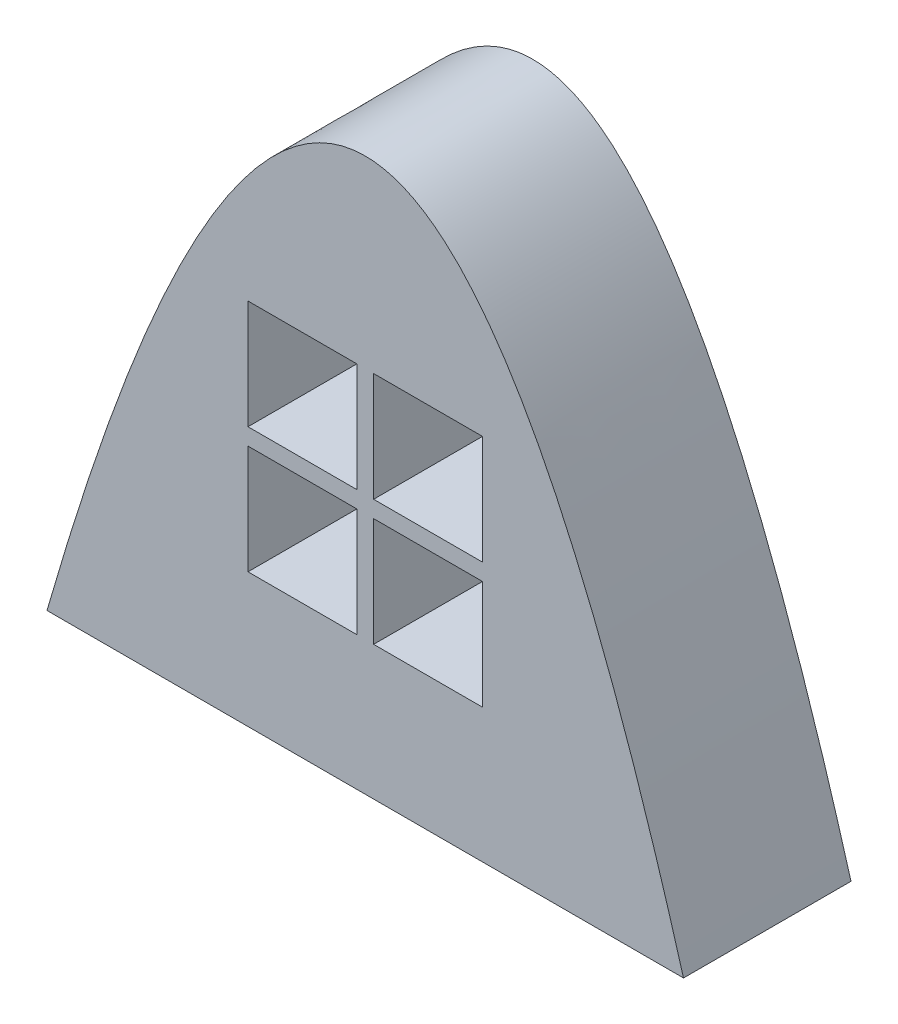
ISO-10303-21;
HEADER;
FILE_DESCRIPTION(('STEP AP214'),'2;1');
FILE_NAME('part.step','',(''),(''),'','','');
FILE_SCHEMA(('AUTOMOTIVE_DESIGN { 1 0 10303 214 1 1 1 1 }'));
ENDSEC;
DATA;
#1=APPLICATION_CONTEXT('core data for automotive mechanical design processes');
#2=APPLICATION_PROTOCOL_DEFINITION('international standard','automotive_design',2000,#1);
#3=PRODUCT_CONTEXT('',#1,'mechanical');
#4=PRODUCT('Part','Part','',(#3));
#5=PRODUCT_RELATED_PRODUCT_CATEGORY('part','',(#4));
#6=PRODUCT_DEFINITION_FORMATION('','',#4);
#7=PRODUCT_DEFINITION_CONTEXT('part definition',#1,'design');
#8=PRODUCT_DEFINITION('design','',#6,#7);
#9=PRODUCT_DEFINITION_SHAPE('','',#8);
#10=(LENGTH_UNIT() NAMED_UNIT(*) SI_UNIT(.MILLI.,.METRE.));
#11=(NAMED_UNIT(*) PLANE_ANGLE_UNIT() SI_UNIT($,.RADIAN.));
#12=(NAMED_UNIT(*) SI_UNIT($,.STERADIAN.) SOLID_ANGLE_UNIT());
#13=UNCERTAINTY_MEASURE_WITH_UNIT(LENGTH_MEASURE(1.E-05),#10,'distance_accuracy_value','');
#14=(GEOMETRIC_REPRESENTATION_CONTEXT(3) GLOBAL_UNCERTAINTY_ASSIGNED_CONTEXT((#13)) GLOBAL_UNIT_ASSIGNED_CONTEXT((#10,
#11,#12)) REPRESENTATION_CONTEXT('',''));
#15=CARTESIAN_POINT('',(0.,0.,0.));
#16=DIRECTION('',(0.,0.,1.));
#17=DIRECTION('',(1.,0.,0.));
#18=AXIS2_PLACEMENT_3D('',#15,#16,#17);
#19=CARTESIAN_POINT('',(0.,0.,10.));
#20=DIRECTION('',(0.,0.,1.));
#21=DIRECTION('',(1.,0.,0.));
#22=AXIS2_PLACEMENT_3D('',#19,#20,#21);
#23=PLANE('',#22);
#24=DIRECTION('',(0.,-1.,0.));
#25=VECTOR('',#24,1.);
#26=CARTESIAN_POINT('',(7.,0.,10.));
#27=LINE('',#26,#25);
#28=CARTESIAN_POINT('',(7.,22.,10.));
#29=VERTEX_POINT('',#28);
#30=CARTESIAN_POINT('',(7.,15.5,10.));
#31=VERTEX_POINT('',#30);
#32=EDGE_CURVE('E269',#29,#31,#27,.T.);
#33=ORIENTED_EDGE('',*,*,#32,.T.);
#34=DIRECTION('',(-1.,0.,0.));
#35=VECTOR('',#34,1.);
#36=CARTESIAN_POINT('',(0.,15.5,10.));
#37=LINE('',#36,#35);
#38=CARTESIAN_POINT('',(0.499999999999999,15.5,10.));
#39=VERTEX_POINT('',#38);
#40=EDGE_CURVE('E272',#31,#39,#37,.T.);
#41=ORIENTED_EDGE('',*,*,#40,.T.);
#42=DIRECTION('',(0.,1.,0.));
#43=VECTOR('',#42,1.);
#44=CARTESIAN_POINT('',(0.499999999999999,0.,10.));
#45=LINE('',#44,#43);
#46=CARTESIAN_POINT('',(0.499999999999999,22.,10.));
#47=VERTEX_POINT('',#46);
#48=EDGE_CURVE('E276',#39,#47,#45,.T.);
#49=ORIENTED_EDGE('',*,*,#48,.T.);
#50=DIRECTION('',(-1.,0.,0.));
#51=VECTOR('',#50,1.);
#52=CARTESIAN_POINT('',(0.,22.,10.));
#53=LINE('',#52,#51);
#54=EDGE_CURVE('E279',#29,#47,#53,.T.);
#55=ORIENTED_EDGE('',*,*,#54,.F.);
#56=EDGE_LOOP('',(#33,#41,#49,#55));
#57=FACE_BOUND('',#56,.T.);
#58=CARTESIAN_POINT('',(-19.,0.,10.));
#59=CARTESIAN_POINT('',(0.,66.,10.));
#60=CARTESIAN_POINT('',(19.,0.,10.));
#61=B_SPLINE_CURVE_WITH_KNOTS('',2,(#58,#59,#60),.UNSPECIFIED.,.F.,.F.,(3,3),(0.,1.),.UNSPECIFIED.);
#62=CARTESIAN_POINT('',(-19.,0.,10.));
#63=VERTEX_POINT('',#62);
#64=CARTESIAN_POINT('',(19.,0.,10.));
#65=VERTEX_POINT('',#64);
#66=EDGE_CURVE('E299',#63,#65,#61,.T.);
#67=ORIENTED_EDGE('',*,*,#66,.F.);
#68=DIRECTION('',(1.,0.,0.));
#69=VECTOR('',#68,1.);
#70=CARTESIAN_POINT('',(0.,0.,10.));
#71=LINE('',#70,#69);
#72=EDGE_CURVE('E305',#63,#65,#71,.T.);
#73=ORIENTED_EDGE('',*,*,#72,.T.);
#74=EDGE_LOOP('',(#67,#73));
#75=FACE_BOUND('',#74,.T.);
#76=DIRECTION('',(0.,1.,0.));
#77=VECTOR('',#76,1.);
#78=CARTESIAN_POINT('',(0.499999999999999,0.,10.));
#79=LINE('',#78,#77);
#80=CARTESIAN_POINT('',(0.499999999999999,8.,10.));
#81=VERTEX_POINT('',#80);
#82=CARTESIAN_POINT('',(0.499999999999999,14.5,10.));
#83=VERTEX_POINT('',#82);
#84=EDGE_CURVE('E179',#81,#83,#79,.T.);
#85=ORIENTED_EDGE('',*,*,#84,.T.);
#86=DIRECTION('',(-1.,0.,0.));
#87=VECTOR('',#86,1.);
#88=CARTESIAN_POINT('',(0.,14.5,10.));
#89=LINE('',#88,#87);
#90=CARTESIAN_POINT('',(7.,14.5,10.));
#91=VERTEX_POINT('',#90);
#92=EDGE_CURVE('E171',#91,#83,#89,.T.);
#93=ORIENTED_EDGE('',*,*,#92,.F.);
#94=DIRECTION('',(0.,-1.,0.));
#95=VECTOR('',#94,1.);
#96=CARTESIAN_POINT('',(7.,0.,10.));
#97=LINE('',#96,#95);
#98=CARTESIAN_POINT('',(7.,8.,10.));
#99=VERTEX_POINT('',#98);
#100=EDGE_CURVE('E183',#91,#99,#97,.T.);
#101=ORIENTED_EDGE('',*,*,#100,.T.);
#102=DIRECTION('',(-1.,0.,0.));
#103=VECTOR('',#102,1.);
#104=CARTESIAN_POINT('',(0.,8.,10.));
#105=LINE('',#104,#103);
#106=EDGE_CURVE('E187',#99,#81,#105,.T.);
#107=ORIENTED_EDGE('',*,*,#106,.T.);
#108=EDGE_LOOP('',(#85,#93,#101,#107));
#109=FACE_BOUND('',#108,.T.);
#110=DIRECTION('',(0.,-1.,0.));
#111=VECTOR('',#110,1.);
#112=CARTESIAN_POINT('',(-7.,0.,10.));
#113=LINE('',#112,#111);
#114=CARTESIAN_POINT('',(-7.,14.5,10.));
#115=VERTEX_POINT('',#114);
#116=CARTESIAN_POINT('',(-7.,8.,10.));
#117=VERTEX_POINT('',#116);
#118=EDGE_CURVE('E218',#115,#117,#113,.T.);
#119=ORIENTED_EDGE('',*,*,#118,.F.);
#120=DIRECTION('',(-1.,0.,0.));
#121=VECTOR('',#120,1.);
#122=CARTESIAN_POINT('',(0.,14.5,10.));
#123=LINE('',#122,#121);
#124=CARTESIAN_POINT('',(-0.500000000000001,14.5,10.));
#125=VERTEX_POINT('',#124);
#126=EDGE_CURVE('E212',#125,#115,#123,.T.);
#127=ORIENTED_EDGE('',*,*,#126,.F.);
#128=DIRECTION('',(0.,1.,0.));
#129=VECTOR('',#128,1.);
#130=CARTESIAN_POINT('',(-0.500000000000001,0.,10.));
#131=LINE('',#130,#129);
#132=CARTESIAN_POINT('',(-0.500000000000001,8.,10.));
#133=VERTEX_POINT('',#132);
#134=EDGE_CURVE('E214',#133,#125,#131,.T.);
#135=ORIENTED_EDGE('',*,*,#134,.F.);
#136=DIRECTION('',(-1.,0.,0.));
#137=VECTOR('',#136,1.);
#138=CARTESIAN_POINT('',(0.,8.,10.));
#139=LINE('',#138,#137);
#140=EDGE_CURVE('E65',#133,#117,#139,.T.);
#141=ORIENTED_EDGE('',*,*,#140,.T.);
#142=EDGE_LOOP('',(#119,#127,#135,#141));
#143=FACE_BOUND('',#142,.T.);
#144=DIRECTION('',(-1.,0.,0.));
#145=VECTOR('',#144,1.);
#146=CARTESIAN_POINT('',(0.,22.,10.));
#147=LINE('',#146,#145);
#148=CARTESIAN_POINT('',(-0.500000000000001,22.,10.));
#149=VERTEX_POINT('',#148);
#150=CARTESIAN_POINT('',(-7.,22.,10.));
#151=VERTEX_POINT('',#150);
#152=EDGE_CURVE('E249',#149,#151,#147,.T.);
#153=ORIENTED_EDGE('',*,*,#152,.F.);
#154=DIRECTION('',(0.,1.,0.));
#155=VECTOR('',#154,1.);
#156=CARTESIAN_POINT('',(-0.500000000000001,0.,10.));
#157=LINE('',#156,#155);
#158=CARTESIAN_POINT('',(-0.500000000000001,15.5,10.));
#159=VERTEX_POINT('',#158);
#160=EDGE_CURVE('E241',#159,#149,#157,.T.);
#161=ORIENTED_EDGE('',*,*,#160,.F.);
#162=DIRECTION('',(-1.,0.,0.));
#163=VECTOR('',#162,1.);
#164=CARTESIAN_POINT('',(0.,15.5,10.));
#165=LINE('',#164,#163);
#166=CARTESIAN_POINT('',(-7.,15.5,10.));
#167=VERTEX_POINT('',#166);
#168=EDGE_CURVE('E243',#159,#167,#165,.T.);
#169=ORIENTED_EDGE('',*,*,#168,.T.);
#170=DIRECTION('',(0.,-1.,0.));
#171=VECTOR('',#170,1.);
#172=CARTESIAN_POINT('',(-7.,0.,10.));
#173=LINE('',#172,#171);
#174=EDGE_CURVE('E247',#151,#167,#173,.T.);
#175=ORIENTED_EDGE('',*,*,#174,.F.);
#176=EDGE_LOOP('',(#153,#161,#169,#175));
#177=FACE_BOUND('',#176,.T.);
#178=ADVANCED_FACE('F41',(#57,#75,#109,#143,#177),#23,.T.);
#179=CARTESIAN_POINT('',(0.,0.,0.));
#180=DIRECTION('',(0.,0.,1.));
#181=DIRECTION('',(1.,0.,0.));
#182=AXIS2_PLACEMENT_3D('',#179,#180,#181);
#183=PLANE('',#182);
#184=DIRECTION('',(-1.,0.,0.));
#185=VECTOR('',#184,1.);
#186=CARTESIAN_POINT('',(0.,14.5,0.));
#187=LINE('',#186,#185);
#188=CARTESIAN_POINT('',(-0.500000000000001,14.5,0.));
#189=VERTEX_POINT('',#188);
#190=CARTESIAN_POINT('',(-7.,14.5,0.));
#191=VERTEX_POINT('',#190);
#192=EDGE_CURVE('E221',#189,#191,#187,.T.);
#193=ORIENTED_EDGE('',*,*,#192,.T.);
#194=DIRECTION('',(0.,-1.,0.));
#195=VECTOR('',#194,1.);
#196=CARTESIAN_POINT('',(-7.,0.,0.));
#197=LINE('',#196,#195);
#198=CARTESIAN_POINT('',(-7.,8.,0.));
#199=VERTEX_POINT('',#198);
#200=EDGE_CURVE('E215',#191,#199,#197,.T.);
#201=ORIENTED_EDGE('',*,*,#200,.T.);
#202=DIRECTION('',(-1.,0.,0.));
#203=VECTOR('',#202,1.);
#204=CARTESIAN_POINT('',(0.,8.,0.));
#205=LINE('',#204,#203);
#206=CARTESIAN_POINT('',(-0.500000000000001,8.,0.));
#207=VERTEX_POINT('',#206);
#208=EDGE_CURVE('E228',#207,#199,#205,.T.);
#209=ORIENTED_EDGE('',*,*,#208,.F.);
#210=DIRECTION('',(0.,1.,0.));
#211=VECTOR('',#210,1.);
#212=CARTESIAN_POINT('',(-0.500000000000001,0.,0.));
#213=LINE('',#212,#211);
#214=EDGE_CURVE('E224',#207,#189,#213,.T.);
#215=ORIENTED_EDGE('',*,*,#214,.T.);
#216=EDGE_LOOP('',(#193,#201,#209,#215));
#217=FACE_BOUND('',#216,.T.);
#218=CARTESIAN_POINT('',(-19.,0.,0.));
#219=CARTESIAN_POINT('',(0.,66.,0.));
#220=CARTESIAN_POINT('',(19.,0.,0.));
#221=B_SPLINE_CURVE_WITH_KNOTS('',2,(#218,#219,#220),.UNSPECIFIED.,.F.,.F.,(3,3),(0.,1.),.UNSPECIFIED.);
#222=CARTESIAN_POINT('',(-19.,0.,0.));
#223=VERTEX_POINT('',#222);
#224=CARTESIAN_POINT('',(19.,0.,0.));
#225=VERTEX_POINT('',#224);
#226=EDGE_CURVE('E293',#223,#225,#221,.T.);
#227=ORIENTED_EDGE('',*,*,#226,.T.);
#228=DIRECTION('',(1.,0.,0.));
#229=VECTOR('',#228,1.);
#230=CARTESIAN_POINT('',(0.,0.,0.));
#231=LINE('',#230,#229);
#232=EDGE_CURVE('E306',#223,#225,#231,.T.);
#233=ORIENTED_EDGE('',*,*,#232,.F.);
#234=EDGE_LOOP('',(#227,#233));
#235=FACE_BOUND('',#234,.T.);
#236=DIRECTION('',(-1.,0.,0.));
#237=VECTOR('',#236,1.);
#238=CARTESIAN_POINT('',(0.,15.5,0.));
#239=LINE('',#238,#237);
#240=CARTESIAN_POINT('',(7.,15.5,0.));
#241=VERTEX_POINT('',#240);
#242=CARTESIAN_POINT('',(0.499999999999999,15.5,0.));
#243=VERTEX_POINT('',#242);
#244=EDGE_CURVE('E283',#241,#243,#239,.T.);
#245=ORIENTED_EDGE('',*,*,#244,.F.);
#246=DIRECTION('',(0.,-1.,0.));
#247=VECTOR('',#246,1.);
#248=CARTESIAN_POINT('',(7.,0.,0.));
#249=LINE('',#248,#247);
#250=CARTESIAN_POINT('',(7.,22.,0.));
#251=VERTEX_POINT('',#250);
#252=EDGE_CURVE('E208',#251,#241,#249,.T.);
#253=ORIENTED_EDGE('',*,*,#252,.F.);
#254=DIRECTION('',(-1.,0.,0.));
#255=VECTOR('',#254,1.);
#256=CARTESIAN_POINT('',(0.,22.,0.));
#257=LINE('',#256,#255);
#258=CARTESIAN_POINT('',(0.499999999999999,22.,0.));
#259=VERTEX_POINT('',#258);
#260=EDGE_CURVE('E273',#251,#259,#257,.T.);
#261=ORIENTED_EDGE('',*,*,#260,.T.);
#262=DIRECTION('',(0.,1.,0.));
#263=VECTOR('',#262,1.);
#264=CARTESIAN_POINT('',(0.499999999999999,0.,0.));
#265=LINE('',#264,#263);
#266=EDGE_CURVE('E286',#243,#259,#265,.T.);
#267=ORIENTED_EDGE('',*,*,#266,.F.);
#268=EDGE_LOOP('',(#245,#253,#261,#267));
#269=FACE_BOUND('',#268,.T.);
#270=DIRECTION('',(-1.,0.,0.));
#271=VECTOR('',#270,1.);
#272=CARTESIAN_POINT('',(0.,14.5,0.));
#273=LINE('',#272,#271);
#274=CARTESIAN_POINT('',(7.,14.5,0.));
#275=VERTEX_POINT('',#274);
#276=CARTESIAN_POINT('',(0.499999999999999,14.5,0.));
#277=VERTEX_POINT('',#276);
#278=EDGE_CURVE('E174',#275,#277,#273,.T.);
#279=ORIENTED_EDGE('',*,*,#278,.T.);
#280=DIRECTION('',(0.,1.,0.));
#281=VECTOR('',#280,1.);
#282=CARTESIAN_POINT('',(0.499999999999999,0.,0.));
#283=LINE('',#282,#281);
#284=CARTESIAN_POINT('',(0.499999999999999,8.,0.));
#285=VERTEX_POINT('',#284);
#286=EDGE_CURVE('E192',#285,#277,#283,.T.);
#287=ORIENTED_EDGE('',*,*,#286,.F.);
#288=DIRECTION('',(-1.,0.,0.));
#289=VECTOR('',#288,1.);
#290=CARTESIAN_POINT('',(0.,8.,0.));
#291=LINE('',#290,#289);
#292=CARTESIAN_POINT('',(7.,8.,0.));
#293=VERTEX_POINT('',#292);
#294=EDGE_CURVE('E195',#293,#285,#291,.T.);
#295=ORIENTED_EDGE('',*,*,#294,.F.);
#296=DIRECTION('',(0.,-1.,0.));
#297=VECTOR('',#296,1.);
#298=CARTESIAN_POINT('',(7.,0.,0.));
#299=LINE('',#298,#297);
#300=EDGE_CURVE('E201',#275,#293,#299,.T.);
#301=ORIENTED_EDGE('',*,*,#300,.F.);
#302=EDGE_LOOP('',(#279,#287,#295,#301));
#303=FACE_BOUND('',#302,.T.);
#304=DIRECTION('',(0.,1.,0.));
#305=VECTOR('',#304,1.);
#306=CARTESIAN_POINT('',(-0.500000000000001,0.,0.));
#307=LINE('',#306,#305);
#308=CARTESIAN_POINT('',(-0.500000000000001,15.5,0.));
#309=VERTEX_POINT('',#308);
#310=CARTESIAN_POINT('',(-0.500000000000001,22.,0.));
#311=VERTEX_POINT('',#310);
#312=EDGE_CURVE('E252',#309,#311,#307,.T.);
#313=ORIENTED_EDGE('',*,*,#312,.T.);
#314=DIRECTION('',(-1.,0.,0.));
#315=VECTOR('',#314,1.);
#316=CARTESIAN_POINT('',(0.,22.,0.));
#317=LINE('',#316,#315);
#318=CARTESIAN_POINT('',(-7.,22.,0.));
#319=VERTEX_POINT('',#318);
#320=EDGE_CURVE('E244',#311,#319,#317,.T.);
#321=ORIENTED_EDGE('',*,*,#320,.T.);
#322=DIRECTION('',(0.,-1.,0.));
#323=VECTOR('',#322,1.);
#324=CARTESIAN_POINT('',(-7.,0.,0.));
#325=LINE('',#324,#323);
#326=CARTESIAN_POINT('',(-7.,15.5,0.));
#327=VERTEX_POINT('',#326);
#328=EDGE_CURVE('E257',#319,#327,#325,.T.);
#329=ORIENTED_EDGE('',*,*,#328,.T.);
#330=DIRECTION('',(-1.,0.,0.));
#331=VECTOR('',#330,1.);
#332=CARTESIAN_POINT('',(0.,15.5,0.));
#333=LINE('',#332,#331);
#334=EDGE_CURVE('E255',#309,#327,#333,.T.);
#335=ORIENTED_EDGE('',*,*,#334,.F.);
#336=EDGE_LOOP('',(#313,#321,#329,#335));
#337=FACE_BOUND('',#336,.T.);
#338=ADVANCED_FACE('F328',(#217,#235,#269,#303,#337),#183,.F.);
#339=DIRECTION('',(0.,0.,-1.));
#340=VECTOR('',#339,1.);
#341=SURFACE_OF_LINEAR_EXTRUSION('',#61,#340);
#342=ORIENTED_EDGE('',*,*,#226,.F.);
#343=DIRECTION('',(0.,0.,-1.));
#344=VECTOR('',#343,1.);
#345=CARTESIAN_POINT('',(-19.,0.,10.));
#346=LINE('',#345,#344);
#347=EDGE_CURVE('E11',#63,#223,#346,.T.);
#348=ORIENTED_EDGE('',*,*,#347,.F.);
#349=ORIENTED_EDGE('',*,*,#66,.T.);
#350=DIRECTION('',(0.,0.,-1.));
#351=VECTOR('',#350,1.);
#352=CARTESIAN_POINT('',(19.,0.,10.));
#353=LINE('',#352,#351);
#354=EDGE_CURVE('E50',#65,#225,#353,.T.);
#355=ORIENTED_EDGE('',*,*,#354,.T.);
#356=EDGE_LOOP('',(#342,#348,#349,#355));
#357=FACE_BOUND('',#356,.T.);
#358=ADVANCED_FACE('F43',(#357),#341,.T.);
#359=CARTESIAN_POINT('',(0.,0.,10.));
#360=DIRECTION('',(0.,1.,0.));
#361=DIRECTION('',(0.,0.,1.));
#362=AXIS2_PLACEMENT_3D('',#359,#360,#361);
#363=PLANE('',#362);
#364=ORIENTED_EDGE('',*,*,#232,.T.);
#365=ORIENTED_EDGE('',*,*,#354,.F.);
#366=ORIENTED_EDGE('',*,*,#72,.F.);
#367=ORIENTED_EDGE('',*,*,#347,.T.);
#368=EDGE_LOOP('',(#364,#365,#366,#367));
#369=FACE_BOUND('',#368,.T.);
#370=ADVANCED_FACE('F326',(#369),#363,.F.);
#371=CARTESIAN_POINT('',(7.,0.,10.));
#372=DIRECTION('',(1.,0.,0.));
#373=DIRECTION('',(0.,0.,-1.));
#374=AXIS2_PLACEMENT_3D('',#371,#372,#373);
#375=PLANE('',#374);
#376=ORIENTED_EDGE('',*,*,#252,.T.);
#377=DIRECTION('',(0.,0.,-1.));
#378=VECTOR('',#377,1.);
#379=CARTESIAN_POINT('',(7.,15.5,10.));
#380=LINE('',#379,#378);
#381=EDGE_CURVE('E281',#31,#241,#380,.T.);
#382=ORIENTED_EDGE('',*,*,#381,.F.);
#383=ORIENTED_EDGE('',*,*,#32,.F.);
#384=DIRECTION('',(0.,0.,-1.));
#385=VECTOR('',#384,1.);
#386=CARTESIAN_POINT('',(7.,22.,10.));
#387=LINE('',#386,#385);
#388=EDGE_CURVE('E291',#29,#251,#387,.T.);
#389=ORIENTED_EDGE('',*,*,#388,.T.);
#390=EDGE_LOOP('',(#376,#382,#383,#389));
#391=FACE_BOUND('',#390,.T.);
#392=ADVANCED_FACE('F370',(#391),#375,.F.);
#393=CARTESIAN_POINT('',(0.,22.,10.));
#394=DIRECTION('',(0.,-1.,0.));
#395=DIRECTION('',(0.,0.,-1.));
#396=AXIS2_PLACEMENT_3D('',#393,#394,#395);
#397=PLANE('',#396);
#398=ORIENTED_EDGE('',*,*,#260,.F.);
#399=ORIENTED_EDGE('',*,*,#388,.F.);
#400=ORIENTED_EDGE('',*,*,#54,.T.);
#401=DIRECTION('',(0.,0.,-1.));
#402=VECTOR('',#401,1.);
#403=CARTESIAN_POINT('',(0.499999999999999,22.,10.));
#404=LINE('',#403,#402);
#405=EDGE_CURVE('E294',#47,#259,#404,.T.);
#406=ORIENTED_EDGE('',*,*,#405,.T.);
#407=EDGE_LOOP('',(#398,#399,#400,#406));
#408=FACE_BOUND('',#407,.T.);
#409=ADVANCED_FACE('F376',(#408),#397,.T.);
#410=CARTESIAN_POINT('',(0.499999999999999,0.,10.));
#411=DIRECTION('',(-1.,0.,0.));
#412=DIRECTION('',(0.,0.,1.));
#413=AXIS2_PLACEMENT_3D('',#410,#411,#412);
#414=PLANE('',#413);
#415=ORIENTED_EDGE('',*,*,#266,.T.);
#416=ORIENTED_EDGE('',*,*,#405,.F.);
#417=ORIENTED_EDGE('',*,*,#48,.F.);
#418=DIRECTION('',(0.,0.,-1.));
#419=VECTOR('',#418,1.);
#420=CARTESIAN_POINT('',(0.499999999999999,15.5,10.));
#421=LINE('',#420,#419);
#422=EDGE_CURVE('E296',#39,#243,#421,.T.);
#423=ORIENTED_EDGE('',*,*,#422,.T.);
#424=EDGE_LOOP('',(#415,#416,#417,#423));
#425=FACE_BOUND('',#424,.T.);
#426=ADVANCED_FACE('F415',(#425),#414,.F.);
#427=CARTESIAN_POINT('',(0.,15.5,10.));
#428=DIRECTION('',(0.,-1.,0.));
#429=DIRECTION('',(0.,0.,-1.));
#430=AXIS2_PLACEMENT_3D('',#427,#428,#429);
#431=PLANE('',#430);
#432=ORIENTED_EDGE('',*,*,#244,.T.);
#433=ORIENTED_EDGE('',*,*,#422,.F.);
#434=ORIENTED_EDGE('',*,*,#40,.F.);
#435=ORIENTED_EDGE('',*,*,#381,.T.);
#436=EDGE_LOOP('',(#432,#433,#434,#435));
#437=FACE_BOUND('',#436,.T.);
#438=ADVANCED_FACE('F425',(#437),#431,.F.);
#439=CARTESIAN_POINT('',(0.,14.5,10.));
#440=DIRECTION('',(0.,-1.,0.));
#441=DIRECTION('',(0.,0.,-1.));
#442=AXIS2_PLACEMENT_3D('',#439,#440,#441);
#443=PLANE('',#442);
#444=ORIENTED_EDGE('',*,*,#278,.F.);
#445=DIRECTION('',(0.,0.,-1.));
#446=VECTOR('',#445,1.);
#447=CARTESIAN_POINT('',(7.,14.5,10.));
#448=LINE('',#447,#446);
#449=EDGE_CURVE('E167',#91,#275,#448,.T.);
#450=ORIENTED_EDGE('',*,*,#449,.F.);
#451=ORIENTED_EDGE('',*,*,#92,.T.);
#452=DIRECTION('',(0.,0.,-1.));
#453=VECTOR('',#452,1.);
#454=CARTESIAN_POINT('',(0.499999999999999,14.5,10.));
#455=LINE('',#454,#453);
#456=EDGE_CURVE('E206',#83,#277,#455,.T.);
#457=ORIENTED_EDGE('',*,*,#456,.T.);
#458=EDGE_LOOP('',(#444,#450,#451,#457));
#459=FACE_BOUND('',#458,.T.);
#460=ADVANCED_FACE('F169',(#459),#443,.T.);
#461=CARTESIAN_POINT('',(0.499999999999999,0.,10.));
#462=DIRECTION('',(-1.,0.,0.));
#463=DIRECTION('',(0.,0.,1.));
#464=AXIS2_PLACEMENT_3D('',#461,#462,#463);
#465=PLANE('',#464);
#466=ORIENTED_EDGE('',*,*,#286,.T.);
#467=ORIENTED_EDGE('',*,*,#456,.F.);
#468=ORIENTED_EDGE('',*,*,#84,.F.);
#469=DIRECTION('',(0.,0.,-1.));
#470=VECTOR('',#469,1.);
#471=CARTESIAN_POINT('',(0.499999999999999,8.,10.));
#472=LINE('',#471,#470);
#473=EDGE_CURVE('E209',#81,#285,#472,.T.);
#474=ORIENTED_EDGE('',*,*,#473,.T.);
#475=EDGE_LOOP('',(#466,#467,#468,#474));
#476=FACE_BOUND('',#475,.T.);
#477=ADVANCED_FACE('F443',(#476),#465,.F.);
#478=CARTESIAN_POINT('',(0.,8.,10.));
#479=DIRECTION('',(0.,-1.,0.));
#480=DIRECTION('',(0.,0.,-1.));
#481=AXIS2_PLACEMENT_3D('',#478,#479,#480);
#482=PLANE('',#481);
#483=ORIENTED_EDGE('',*,*,#294,.T.);
#484=ORIENTED_EDGE('',*,*,#473,.F.);
#485=ORIENTED_EDGE('',*,*,#106,.F.);
#486=DIRECTION('',(0.,0.,-1.));
#487=VECTOR('',#486,1.);
#488=CARTESIAN_POINT('',(7.,8.,10.));
#489=LINE('',#488,#487);
#490=EDGE_CURVE('E178',#99,#293,#489,.T.);
#491=ORIENTED_EDGE('',*,*,#490,.T.);
#492=EDGE_LOOP('',(#483,#484,#485,#491));
#493=FACE_BOUND('',#492,.T.);
#494=ADVANCED_FACE('F452',(#493),#482,.F.);
#495=CARTESIAN_POINT('',(7.,0.,10.));
#496=DIRECTION('',(1.,0.,0.));
#497=DIRECTION('',(0.,0.,-1.));
#498=AXIS2_PLACEMENT_3D('',#495,#496,#497);
#499=PLANE('',#498);
#500=ORIENTED_EDGE('',*,*,#300,.T.);
#501=ORIENTED_EDGE('',*,*,#490,.F.);
#502=ORIENTED_EDGE('',*,*,#100,.F.);
#503=ORIENTED_EDGE('',*,*,#449,.T.);
#504=EDGE_LOOP('',(#500,#501,#502,#503));
#505=FACE_BOUND('',#504,.T.);
#506=ADVANCED_FACE('F184',(#505),#499,.F.);
#507=CARTESIAN_POINT('',(0.,14.5,10.));
#508=DIRECTION('',(0.,-1.,0.));
#509=DIRECTION('',(0.,0.,-1.));
#510=AXIS2_PLACEMENT_3D('',#507,#508,#509);
#511=PLANE('',#510);
#512=ORIENTED_EDGE('',*,*,#192,.F.);
#513=DIRECTION('',(0.,0.,-1.));
#514=VECTOR('',#513,1.);
#515=CARTESIAN_POINT('',(-0.500000000000001,14.5,10.));
#516=LINE('',#515,#514);
#517=EDGE_CURVE('E220',#125,#189,#516,.T.);
#518=ORIENTED_EDGE('',*,*,#517,.F.);
#519=ORIENTED_EDGE('',*,*,#126,.T.);
#520=DIRECTION('',(0.,0.,-1.));
#521=VECTOR('',#520,1.);
#522=CARTESIAN_POINT('',(-7.,14.5,10.));
#523=LINE('',#522,#521);
#524=EDGE_CURVE('E202',#115,#191,#523,.T.);
#525=ORIENTED_EDGE('',*,*,#524,.T.);
#526=EDGE_LOOP('',(#512,#518,#519,#525));
#527=FACE_BOUND('',#526,.T.);
#528=ADVANCED_FACE('F471',(#527),#511,.T.);
#529=CARTESIAN_POINT('',(-7.,0.,10.));
#530=DIRECTION('',(1.,0.,0.));
#531=DIRECTION('',(0.,0.,-1.));
#532=AXIS2_PLACEMENT_3D('',#529,#530,#531);
#533=PLANE('',#532);
#534=ORIENTED_EDGE('',*,*,#200,.F.);
#535=ORIENTED_EDGE('',*,*,#524,.F.);
#536=ORIENTED_EDGE('',*,*,#118,.T.);
#537=DIRECTION('',(0.,0.,-1.));
#538=VECTOR('',#537,1.);
#539=CARTESIAN_POINT('',(-7.,8.,10.));
#540=LINE('',#539,#538);
#541=EDGE_CURVE('E235',#117,#199,#540,.T.);
#542=ORIENTED_EDGE('',*,*,#541,.T.);
#543=EDGE_LOOP('',(#534,#535,#536,#542));
#544=FACE_BOUND('',#543,.T.);
#545=ADVANCED_FACE('F480',(#544),#533,.T.);
#546=CARTESIAN_POINT('',(0.,8.,10.));
#547=DIRECTION('',(0.,-1.,0.));
#548=DIRECTION('',(0.,0.,-1.));
#549=AXIS2_PLACEMENT_3D('',#546,#547,#548);
#550=PLANE('',#549);
#551=ORIENTED_EDGE('',*,*,#208,.T.);
#552=ORIENTED_EDGE('',*,*,#541,.F.);
#553=ORIENTED_EDGE('',*,*,#140,.F.);
#554=DIRECTION('',(0.,0.,-1.));
#555=VECTOR('',#554,1.);
#556=CARTESIAN_POINT('',(-0.500000000000001,8.,10.));
#557=LINE('',#556,#555);
#558=EDGE_CURVE('E237',#133,#207,#557,.T.);
#559=ORIENTED_EDGE('',*,*,#558,.T.);
#560=EDGE_LOOP('',(#551,#552,#553,#559));
#561=FACE_BOUND('',#560,.T.);
#562=ADVANCED_FACE('F490',(#561),#550,.F.);
#563=CARTESIAN_POINT('',(-0.500000000000001,0.,10.));
#564=DIRECTION('',(-1.,0.,0.));
#565=DIRECTION('',(0.,0.,1.));
#566=AXIS2_PLACEMENT_3D('',#563,#564,#565);
#567=PLANE('',#566);
#568=ORIENTED_EDGE('',*,*,#214,.F.);
#569=ORIENTED_EDGE('',*,*,#558,.F.);
#570=ORIENTED_EDGE('',*,*,#134,.T.);
#571=ORIENTED_EDGE('',*,*,#517,.T.);
#572=EDGE_LOOP('',(#568,#569,#570,#571));
#573=FACE_BOUND('',#572,.T.);
#574=ADVANCED_FACE('F500',(#573),#567,.T.);
#575=CARTESIAN_POINT('',(-0.500000000000001,0.,10.));
#576=DIRECTION('',(-1.,0.,0.));
#577=DIRECTION('',(0.,0.,1.));
#578=AXIS2_PLACEMENT_3D('',#575,#576,#577);
#579=PLANE('',#578);
#580=ORIENTED_EDGE('',*,*,#312,.F.);
#581=DIRECTION('',(0.,0.,-1.));
#582=VECTOR('',#581,1.);
#583=CARTESIAN_POINT('',(-0.500000000000001,15.5,10.));
#584=LINE('',#583,#582);
#585=EDGE_CURVE('E251',#159,#309,#584,.T.);
#586=ORIENTED_EDGE('',*,*,#585,.F.);
#587=ORIENTED_EDGE('',*,*,#160,.T.);
#588=DIRECTION('',(0.,0.,-1.));
#589=VECTOR('',#588,1.);
#590=CARTESIAN_POINT('',(-0.500000000000001,22.,10.));
#591=LINE('',#590,#589);
#592=EDGE_CURVE('E225',#149,#311,#591,.T.);
#593=ORIENTED_EDGE('',*,*,#592,.T.);
#594=EDGE_LOOP('',(#580,#586,#587,#593));
#595=FACE_BOUND('',#594,.T.);
#596=ADVANCED_FACE('F341',(#595),#579,.T.);
#597=CARTESIAN_POINT('',(0.,22.,10.));
#598=DIRECTION('',(0.,-1.,0.));
#599=DIRECTION('',(0.,0.,-1.));
#600=AXIS2_PLACEMENT_3D('',#597,#598,#599);
#601=PLANE('',#600);
#602=ORIENTED_EDGE('',*,*,#320,.F.);
#603=ORIENTED_EDGE('',*,*,#592,.F.);
#604=ORIENTED_EDGE('',*,*,#152,.T.);
#605=DIRECTION('',(0.,0.,-1.));
#606=VECTOR('',#605,1.);
#607=CARTESIAN_POINT('',(-7.,22.,10.));
#608=LINE('',#607,#606);
#609=EDGE_CURVE('E264',#151,#319,#608,.T.);
#610=ORIENTED_EDGE('',*,*,#609,.T.);
#611=EDGE_LOOP('',(#602,#603,#604,#610));
#612=FACE_BOUND('',#611,.T.);
#613=ADVANCED_FACE('F349',(#612),#601,.T.);
#614=CARTESIAN_POINT('',(-7.,0.,10.));
#615=DIRECTION('',(1.,0.,0.));
#616=DIRECTION('',(0.,0.,-1.));
#617=AXIS2_PLACEMENT_3D('',#614,#615,#616);
#618=PLANE('',#617);
#619=ORIENTED_EDGE('',*,*,#328,.F.);
#620=ORIENTED_EDGE('',*,*,#609,.F.);
#621=ORIENTED_EDGE('',*,*,#174,.T.);
#622=DIRECTION('',(0.,0.,-1.));
#623=VECTOR('',#622,1.);
#624=CARTESIAN_POINT('',(-7.,15.5,10.));
#625=LINE('',#624,#623);
#626=EDGE_CURVE('E57',#167,#327,#625,.T.);
#627=ORIENTED_EDGE('',*,*,#626,.T.);
#628=EDGE_LOOP('',(#619,#620,#621,#627));
#629=FACE_BOUND('',#628,.T.);
#630=ADVANCED_FACE('F353',(#629),#618,.T.);
#631=CARTESIAN_POINT('',(0.,15.5,10.));
#632=DIRECTION('',(0.,-1.,0.));
#633=DIRECTION('',(0.,0.,-1.));
#634=AXIS2_PLACEMENT_3D('',#631,#632,#633);
#635=PLANE('',#634);
#636=ORIENTED_EDGE('',*,*,#334,.T.);
#637=ORIENTED_EDGE('',*,*,#626,.F.);
#638=ORIENTED_EDGE('',*,*,#168,.F.);
#639=ORIENTED_EDGE('',*,*,#585,.T.);
#640=EDGE_LOOP('',(#636,#637,#638,#639));
#641=FACE_BOUND('',#640,.T.);
#642=ADVANCED_FACE('F343',(#641),#635,.F.);
#643=CLOSED_SHELL('',(#178,#338,#358,#370,#392,#409,#426,#438,#460,#477,#494,#506,#528,#545,
#562,#574,#596,#613,#630,#642));
#644=MANIFOLD_SOLID_BREP('B2',#643);
#645=ADVANCED_BREP_SHAPE_REPRESENTATION('',(#18,#644),#14);
#646=SHAPE_DEFINITION_REPRESENTATION(#9,#645);
ENDSEC;
END-ISO-10303-21;
